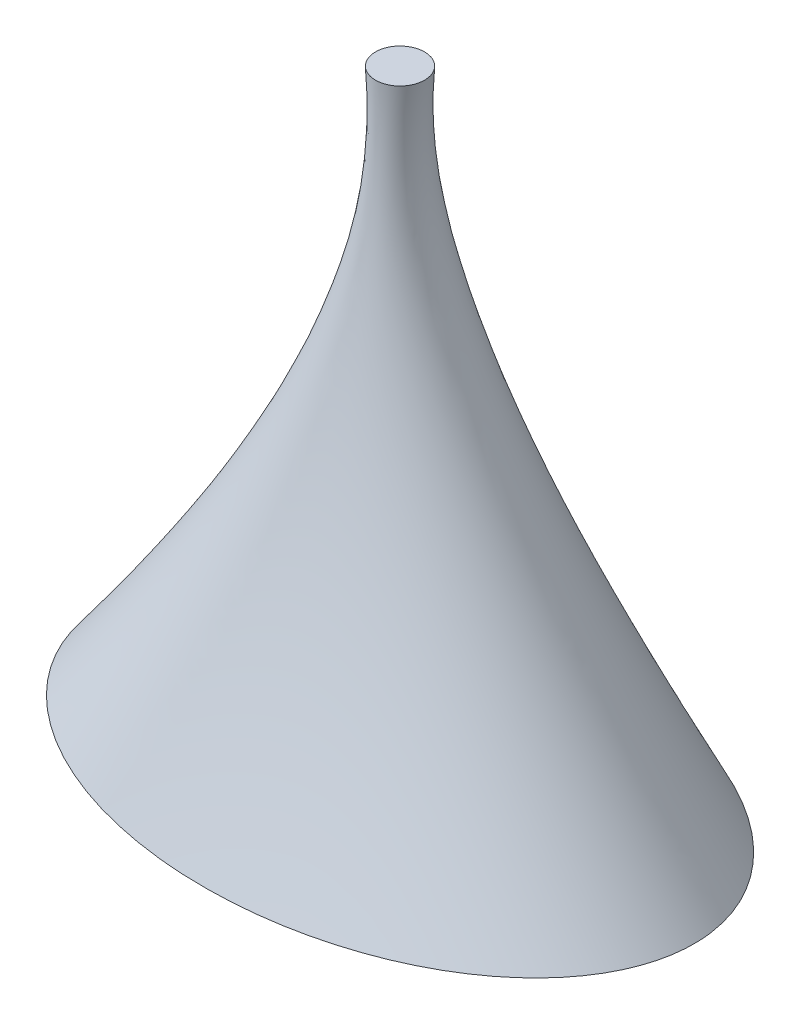
ISO-10303-21;
HEADER;
FILE_DESCRIPTION(('STEP AP214'),'2;1');
FILE_NAME('part.step','',(''),(''),'','','');
FILE_SCHEMA(('AUTOMOTIVE_DESIGN { 1 0 10303 214 1 1 1 1 }'));
ENDSEC;
DATA;
#1=APPLICATION_CONTEXT('core data for automotive mechanical design processes');
#2=APPLICATION_PROTOCOL_DEFINITION('international standard','automotive_design',2000,#1);
#3=PRODUCT_CONTEXT('',#1,'mechanical');
#4=PRODUCT('Part','Part','',(#3));
#5=PRODUCT_RELATED_PRODUCT_CATEGORY('part','',(#4));
#6=PRODUCT_DEFINITION_FORMATION('','',#4);
#7=PRODUCT_DEFINITION_CONTEXT('part definition',#1,'design');
#8=PRODUCT_DEFINITION('design','',#6,#7);
#9=PRODUCT_DEFINITION_SHAPE('','',#8);
#10=(LENGTH_UNIT() NAMED_UNIT(*) SI_UNIT(.MILLI.,.METRE.));
#11=(NAMED_UNIT(*) PLANE_ANGLE_UNIT() SI_UNIT($,.RADIAN.));
#12=(NAMED_UNIT(*) SI_UNIT($,.STERADIAN.) SOLID_ANGLE_UNIT());
#13=UNCERTAINTY_MEASURE_WITH_UNIT(LENGTH_MEASURE(1.E-05),#10,'distance_accuracy_value','');
#14=(GEOMETRIC_REPRESENTATION_CONTEXT(3) GLOBAL_UNCERTAINTY_ASSIGNED_CONTEXT((#13)) GLOBAL_UNIT_ASSIGNED_CONTEXT((#10,
#11,#12)) REPRESENTATION_CONTEXT('',''));
#15=CARTESIAN_POINT('',(0.,0.,0.));
#16=DIRECTION('',(0.,0.,1.));
#17=DIRECTION('',(1.,0.,0.));
#18=AXIS2_PLACEMENT_3D('',#15,#16,#17);
#19=CARTESIAN_POINT('',(0.,125.,0.));
#20=DIRECTION('',(0.,1.,0.));
#21=DIRECTION('',(0.,0.,1.));
#22=AXIS2_PLACEMENT_3D('',#19,#20,#21);
#23=PLANE('',#22);
#24=CARTESIAN_POINT('',(0.,125.,0.));
#25=DIRECTION('',(0.,1.,0.));
#26=DIRECTION('',(0.,0.,1.));
#27=AXIS2_PLACEMENT_3D('',#24,#25,#26);
#28=CIRCLE('',#27,5.);
#29=CARTESIAN_POINT('',(0.,125.,5.));
#30=VERTEX_POINT('',#29);
#31=EDGE_CURVE('E11',#30,#30,#28,.T.);
#32=ORIENTED_EDGE('',*,*,#31,.T.);
#33=EDGE_LOOP('',(#32));
#34=FACE_BOUND('',#33,.T.);
#35=ADVANCED_FACE('F171',(#34),#23,.T.);
#36=CARTESIAN_POINT('',(0.,0.,0.));
#37=DIRECTION('',(0.,1.,0.));
#38=DIRECTION('',(0.,0.,1.));
#39=AXIS2_PLACEMENT_3D('',#36,#37,#38);
#40=PLANE('',#39);
#41=CARTESIAN_POINT('',(0.,0.,0.));
#42=DIRECTION('',(0.,1.,0.));
#43=DIRECTION('',(-1.,0.,0.));
#44=AXIS2_PLACEMENT_3D('',#41,#42,#43);
#45=ELLIPSE('',#44,60.,40.);
#46=CARTESIAN_POINT('',(-60.,0.,0.));
#47=VERTEX_POINT('',#46);
#48=EDGE_CURVE('E179',#47,#47,#45,.T.);
#49=ORIENTED_EDGE('',*,*,#48,.F.);
#50=EDGE_LOOP('',(#49));
#51=FACE_BOUND('',#50,.T.);
#52=ADVANCED_FACE('F202',(#51),#40,.F.);
#53=CARTESIAN_POINT('',(5.57332550270318,0.,-39.8270597170702));
#54=CARTESIAN_POINT('',(3.2212642480343,27.7879100356075,-28.0145697247159));
#55=CARTESIAN_POINT('',(0.181030973703189,68.5723566828229,-11.8747715923263));
#56=CARTESIAN_POINT('',(0.330766092712323,111.121243368941,-4.69280956172269));
#57=CARTESIAN_POINT('',(1.23757826972021,125.,-4.84441947258042));
#58=CARTESIAN_POINT('',(4.78113844945781,0.,-39.8763295835393));
#59=CARTESIAN_POINT('',(2.69743364110282,27.7910347894172,-28.0425728521876));
#60=CARTESIAN_POINT('',(0.0201681260164546,68.5681633061748,-11.8787389328635));
#61=CARTESIAN_POINT('',(0.290784175121644,111.124368122751,-4.69934573589454));
#62=CARTESIAN_POINT('',(1.17073557418818,125.,-4.86149542315575));
#63=CARTESIAN_POINT('',(0.821290003085788,0.,-40.069752536723));
#64=CARTESIAN_POINT('',(0.0828115427077617,27.8038540957584,-28.1455239241916));
#65=CARTESIAN_POINT('',(-0.780944180964747,68.5509599733275,-11.8810467852571));
#66=CARTESIAN_POINT('',(0.092300938849589,111.137187429091,-4.72549640076909));
#67=CARTESIAN_POINT('',(0.836363096021454,125.,-4.93969850237796));
#68=CARTESIAN_POINT('',(-5.0952502478409,0.,-39.9661666214581));
#69=CARTESIAN_POINT('',(-3.8121457554207,27.8015098523949,-28.0268290352452));
#70=CARTESIAN_POINT('',(-1.95516129056789,68.5541059156883,-11.7530361886966));
#71=CARTESIAN_POINT('',(-0.191958678491041,111.134843185728,-4.71863268081314));
#72=CARTESIAN_POINT('',(0.334831114665666,125.,-5.00387511760623));
#73=CARTESIAN_POINT('',(-12.0647488528318,0.,-39.2477993765977));
#74=CARTESIAN_POINT('',(-8.38742537043965,27.7658927196401,-27.4754842079991));
#75=CARTESIAN_POINT('',(-3.29732032017669,68.601903618119,-11.4098976922342));
#76=CARTESIAN_POINT('',(-0.51719285809644,111.099226052973,-4.64518969153398));
#77=CARTESIAN_POINT('',(-0.259357499275969,125.,-5.00235695478864));
#78=CARTESIAN_POINT('',(-17.7393017685295,0.,-38.2784086796769));
#79=CARTESIAN_POINT('',(-12.1089988165161,27.7168661677891,-26.7615494224));
#80=CARTESIAN_POINT('',(-4.3639646494084,68.6676965766005,-11.0101025068101));
#81=CARTESIAN_POINT('',(-0.78046490821042,111.050199501122,-4.54440909060136));
#82=CARTESIAN_POINT('',(-0.746512299668394,125.,-4.952698355113));
#83=CARTESIAN_POINT('',(-23.2515310735226,0.,-36.9427307816643));
#84=CARTESIAN_POINT('',(-15.7219393929096,27.6506883744891,-25.7971828780172));
#85=CARTESIAN_POINT('',(-5.3702445738678,68.7565062652816,-10.5047374353318));
#86=CARTESIAN_POINT('',(-1.03596469609115,110.984021707822,-4.40642414441839));
#87=CARTESIAN_POINT('',(-1.22256603894635,125.,-4.85659263584071));
#88=CARTESIAN_POINT('',(-30.3092178201432,0.,-34.6951281799682));
#89=CARTESIAN_POINT('',(-20.3493832725471,27.5436473858479,-24.1906020672111));
#90=CARTESIAN_POINT('',(-6.62208563938298,68.9001538002525,-9.70010148995228));
#91=CARTESIAN_POINT('',(-1.36889776577987,110.876980719181,-4.17293943217995));
#92=CARTESIAN_POINT('',(-1.83849130817164,125.,-4.66863425398645));
#93=CARTESIAN_POINT('',(-36.9027134885698,0.,-31.7347146942922));
#94=CARTESIAN_POINT('',(-24.6731121888077,27.4139992106011,-22.0968065399869));
#95=CARTESIAN_POINT('',(-7.72476428456456,69.0741398688046,-8.71501171001037));
#96=CARTESIAN_POINT('',(-1.68475641646121,110.747332543934,-3.86974197519519));
#97=CARTESIAN_POINT('',(-2.42017955018995,125.,-4.39411784285191));
#98=CARTESIAN_POINT('',(-42.7559819688184,0.,-28.1553320722511));
#99=CARTESIAN_POINT('',(-28.5214020438933,27.2792817793337,-19.574734899846));
#100=CARTESIAN_POINT('',(-8.66212133160522,69.2549288092358,-7.58934762164839));
#101=CARTESIAN_POINT('',(-1.98736734905318,110.612615112667,-3.49922106624885));
#102=CARTESIAN_POINT('',(-2.95492997926846,125.,-4.04206132265627));
#103=CARTESIAN_POINT('',(-46.6875322605297,0.,-25.2261578393496));
#104=CARTESIAN_POINT('',(-31.1141307170032,27.1810542129565,-17.5057412392253));
#105=CARTESIAN_POINT('',(-9.28143896871314,69.3867488527106,-6.67908194084495));
#106=CARTESIAN_POINT('',(-2.208882065225,110.51438754629,-3.18180447890592));
#107=CARTESIAN_POINT('',(-3.32965926873877,125.,-3.74025269865595));
#108=CARTESIAN_POINT('',(-50.1596349148545,0.,-22.065589230787));
#109=CARTESIAN_POINT('',(-33.4077321504436,27.0883725579063,-15.2675796522241));
#110=CARTESIAN_POINT('',(-9.81379450350495,69.5111263594392,-5.70673715947108));
#111=CARTESIAN_POINT('',(-2.41810247135227,110.42170589124,-2.82497460598047));
#112=CARTESIAN_POINT('',(-3.67519040000185,125.,-3.40168166147901));
#113=CARTESIAN_POINT('',(-53.1440310717068,0.,-18.7032577855153));
#114=CARTESIAN_POINT('',(-35.3805690134177,27.0044764694147,-12.8817085204901));
#115=CARTESIAN_POINT('',(-10.2568516919458,69.6237137566455,-4.68353286940776));
#116=CARTESIAN_POINT('',(-2.60992943094225,110.337809802748,-2.43268013588069));
#117=CARTESIAN_POINT('',(-3.98807169697971,125.,-3.0297152085857));
#118=CARTESIAN_POINT('',(-55.6248331095162,0.,-15.1640932155241));
#119=CARTESIAN_POINT('',(-37.0182801853918,26.931665789461,-10.3674524606833));
#120=CARTESIAN_POINT('',(-10.6077343553895,69.7214246880152,-3.62004625899023));
#121=CARTESIAN_POINT('',(-2.7782924345961,110.264999122795,-2.00987054195542));
#122=CARTESIAN_POINT('',(-4.26485148359432,125.,-2.62772033743631));
#123=CARTESIAN_POINT('',(-57.5805573223675,0.,-11.4693021352257));
#124=CARTESIAN_POINT('',(-38.3035935520885,26.8718508821727,-7.73614078155367));
#125=CARTESIAN_POINT('',(-10.8636739984493,69.8016954711569,-2.51244430471587));
#126=CARTESIAN_POINT('',(-2.91871369459395,110.205184215506,-1.55287513984876));
#127=CARTESIAN_POINT('',(-4.50323753605284,125.,-2.19440367266726));
#128=CARTESIAN_POINT('',(-58.9911389371548,0.,-7.6537690225134));
#129=CARTESIAN_POINT('',(-39.2203202073334,26.8266448562351,-5.00726718995748));
#130=CARTESIAN_POINT('',(-11.0215065011754,69.8623613363939,-1.35613628799415));
#131=CARTESIAN_POINT('',(-3.02685266959215,110.159978189568,-1.05706906755834));
#132=CARTESIAN_POINT('',(-4.7009376305624,125.,-1.72847183891497));
#133=CARTESIAN_POINT('',(-59.8388761748041,0.,-3.72165980089621));
#134=CARTESIAN_POINT('',(-39.7537111666635,26.797764854187,-2.19623220474511));
#135=CARTESIAN_POINT('',(-11.0772250522638,69.9011179020495,-0.176535213550006));
#136=CARTESIAN_POINT('',(-3.09638031024818,110.13109818752,-0.541618806807593));
#137=CARTESIAN_POINT('',(-4.85287989017598,125.,-1.23973970398985));
#138=CARTESIAN_POINT('',(-60.0967926757585,0.,0.247118003628631));
#139=CARTESIAN_POINT('',(-39.8842988750661,26.7863551001767,0.637955320954993));
#140=CARTESIAN_POINT('',(-11.0262395638233,69.9164296350506,1.00299143870759));
#141=CARTESIAN_POINT('',(-3.12243204985721,110.11968843351,-0.0188047719322852));
#142=CARTESIAN_POINT('',(-4.95399243794657,125.,-0.738022135702308));
#143=CARTESIAN_POINT('',(-59.7691581112874,0.,4.17078029698523));
#144=CARTESIAN_POINT('',(-39.6166613362908,26.792858872814,3.43496879940429));
#145=CARTESIAN_POINT('',(-10.8744998508977,69.9077016615967,2.15910021527747));
#146=CARTESIAN_POINT('',(-3.10654742688881,110.126192206147,0.498210851620174));
#147=CARTESIAN_POINT('',(-5.00398724718396,125.,-0.234356624690946));
#148=CARTESIAN_POINT('',(-58.8724693371047,0.,8.04294048169223));
#149=CARTESIAN_POINT('',(-38.9633237576054,26.8165954820894,6.17768895906347));
#150=CARTESIAN_POINT('',(-10.6264078156176,69.8758474583214,3.26668371813831));
#151=CARTESIAN_POINT('',(-3.05006172700082,110.149928815423,0.98920819687241));
#152=CARTESIAN_POINT('',(-5.00257629119795,125.,0.260219338405634));
#153=CARTESIAN_POINT('',(-57.4162195719449,0.,11.8270340776387));
#154=CARTESIAN_POINT('',(-37.9335931081489,26.8569925217433,8.84504205022962));
#155=CARTESIAN_POINT('',(-10.287229460961,69.8216351865543,4.33083784852436));
#156=CARTESIAN_POINT('',(-2.95777768865238,110.190325855077,1.45749606452373));
#157=CARTESIAN_POINT('',(-4.95249644270007,125.,0.745715099079891));
#158=CARTESIAN_POINT('',(-55.4166923718935,0.,15.4992193221685));
#159=CARTESIAN_POINT('',(-36.5412178701254,26.9130240388591,11.4234393176973));
#160=CARTESIAN_POINT('',(-9.86133351373882,69.7464416610041,5.35610036401146));
#161=CARTESIAN_POINT('',(-2.83441267179757,110.246357372192,1.90538643813444));
#162=CARTESIAN_POINT('',(-4.85648457440183,125.,1.22214000282429));
#163=CARTESIAN_POINT('',(-52.8806099122792,0.,19.0336844448711));
#164=CARTESIAN_POINT('',(-34.7942275743768,26.9835461600074,13.8921540351699));
#165=CARTESIAN_POINT('',(-9.35132719194955,69.6518019440836,6.3327933170902));
#166=CARTESIAN_POINT('',(-2.68430941790748,110.316879493341,2.32632409152768));
#167=CARTESIAN_POINT('',(-4.71573267757515,125.,1.6849395294078));
#168=CARTESIAN_POINT('',(-49.8310955112112,0.,22.3966732734114));
#169=CARTESIAN_POINT('',(-32.7106816800946,27.0661940266499,16.2263900644702));
#170=CARTESIAN_POINT('',(-8.75858709892306,69.5408896434363,7.25077616059546));
#171=CARTESIAN_POINT('',(-2.51090650161521,110.399527359983,2.71498065459553));
#172=CARTESIAN_POINT('',(-4.53143274349195,125.,2.1295591585994));
#173=CARTESIAN_POINT('',(-46.2598843943868,0.,25.5766974778085));
#174=CARTESIAN_POINT('',(-30.2915644809613,27.1596513891902,18.4177619925606));
#175=CARTESIAN_POINT('',(-8.0880009870082,69.4154711479214,8.10716295897027));
#176=CARTESIAN_POINT('',(-2.32233845934943,110.492984722524,3.06905493863085));
#177=CARTESIAN_POINT('',(-4.30604536196897,125.,2.55363689691381));
#178=CARTESIAN_POINT('',(-42.2327451787448,0.,28.5046430582213));
#179=CARTESIAN_POINT('',(-27.5810967142616,27.2594965883809,20.4259653751115));
#180=CARTESIAN_POINT('',(-7.34163643869073,69.2814802634533,8.89893445137177));
#181=CARTESIAN_POINT('',(-2.1206206769804,110.592829921714,3.39274383687445));
#182=CARTESIAN_POINT('',(-4.04203112282299,125.,2.95481075086571));
#183=CARTESIAN_POINT('',(-37.8393944397212,0.,31.1246359651207));
#184=CARTESIAN_POINT('',(-24.6346700560955,27.3603986746669,22.2171752919905));
#185=CARTESIAN_POINT('',(-6.51715674143735,69.1460710510351,9.61732663054362));
#186=CARTESIAN_POINT('',(-1.90192973435437,110.693732008,3.68727302091207));
#187=CARTESIAN_POINT('',(-3.74028395710942,125.,3.329782558503));
#188=CARTESIAN_POINT('',(-33.0982967419764,0.,33.439967237339));
#189=CARTESIAN_POINT('',(-21.4658715541901,27.45900817898,23.7912133614625));
#190=CARTESIAN_POINT('',(-5.61519779546935,69.0137384521021,10.2525383816733));
#191=CARTESIAN_POINT('',(-1.6681389234616,110.792341512313,3.9480713084855));
#192=CARTESIAN_POINT('',(-3.40169779588368,125.,3.67525415787352));
#193=CARTESIAN_POINT('',(-28.0549336341112,0.,35.4292407819776));
#194=CARTESIAN_POINT('',(-18.1067367278928,27.5516717270273,25.1351241536073));
#195=CARTESIAN_POINT('',(-4.64463257853923,68.8893852447221,10.7969149720785));
#196=CARTESIAN_POINT('',(-1.42324660483837,110.885005060361,4.1743007692187));
#197=CARTESIAN_POINT('',(-3.02969844952953,125.,3.98800570539482));
#198=CARTESIAN_POINT('',(-22.7461146482497,0.,37.0832827657881));
#199=CARTESIAN_POINT('',(-14.5836398402852,27.6347645571587,26.2430526182473));
#200=CARTESIAN_POINT('',(-3.61546516070464,68.7778758091907,11.2423865098466));
#201=CARTESIAN_POINT('',(-1.1713712270726,110.968097890492,4.36407567937826));
#202=CARTESIAN_POINT('',(-2.62771172843075,125.,4.26481735748442));
#203=CARTESIAN_POINT('',(-17.203966683491,0.,38.3870057194704));
#204=CARTESIAN_POINT('',(-10.9133052196749,27.7044613641954,27.105489564585));
#205=CARTESIAN_POINT('',(-2.52475303822047,68.6843436524604,11.5799622143044));
#206=CARTESIAN_POINT('',(-0.906935892045749,111.037794697529,4.51633431652351));
#207=CARTESIAN_POINT('',(-2.19441269204738,125.,4.5032728473781));
#208=CARTESIAN_POINT('',(-11.4806463172432,0.,39.3274433532137));
#209=CARTESIAN_POINT('',(-7.12287469370834,27.7572868970712,27.7140125736758));
#210=CARTESIAN_POINT('',(-1.37050857293865,68.6134525136784,11.8007745163379));
#211=CARTESIAN_POINT('',(-0.621428082105848,111.090620230405,4.62968761040779));
#212=CARTESIAN_POINT('',(-1.72847639983947,125.,4.70095590831165));
#213=CARTESIAN_POINT('',(-5.58249356427619,0.,39.8925748051677));
#214=CARTESIAN_POINT('',(-3.22610077717778,27.7914746569241,28.0602064102002));
#215=CARTESIAN_POINT('',(-0.181983242082666,68.5675730100287,11.8968331193063));
#216=CARTESIAN_POINT('',(-0.33092825789369,111.124807990257,4.70039721505753));
#217=CARTESIAN_POINT('',(-1.23973478535005,125.,4.85286101245369));
#218=CARTESIAN_POINT('',(0.370679073195328,0.,40.0645334347085));
#219=CARTESIAN_POINT('',(0.699700371902132,27.8042604168041,28.132385126633));
#220=CARTESIAN_POINT('',(1.01226294980343,68.5504146960705,11.8601781083796));
#221=CARTESIAN_POINT('',(-0.0394321983095323,111.137593750138,4.72535125814249));
#222=CARTESIAN_POINT('',(-0.738019782122169,125.,4.95398263197284));
#223=CARTESIAN_POINT('',(6.25616933866184,0.,39.8461027395769));
#224=CARTESIAN_POINT('',(4.57600529394097,27.7955851042959,27.934779440977));
#225=CARTESIAN_POINT('',(2.18280066250424,68.5620568461736,11.6959655968838));
#226=CARTESIAN_POINT('',(0.248986116715864,111.128918437629,4.70670915335063));
#227=CARTESIAN_POINT('',(-0.23435942717582,125.,5.00399730813729));
#228=CARTESIAN_POINT('',(12.0644113149742,0.,39.2483143195083));
#229=CARTESIAN_POINT('',(8.38801375547082,27.7659309131903,27.4757714204791));
#230=CARTESIAN_POINT('',(3.29904427831529,68.6018523628997,11.4099307910766));
#231=CARTESIAN_POINT('',(0.518551707134026,111.099264246524,4.64528292895037));
#232=CARTESIAN_POINT('',(0.260218242469005,125.,5.00258158221525));
#233=CARTESIAN_POINT('',(17.7405507993775,0.,38.2774789501818));
#234=CARTESIAN_POINT('',(12.108344666811,27.7167890072187,26.760999618124));
#235=CARTESIAN_POINT('',(4.36091069312301,68.6678001250251,11.0099787554193));
#236=CARTESIAN_POINT('',(0.778455411345825,111.050122340552,4.54434107736264));
#237=CARTESIAN_POINT('',(0.745716916179653,125.,4.95249113903971));
#238=CARTESIAN_POINT('',(23.2488291529081,0.,36.9444619904788));
#239=CARTESIAN_POINT('',(15.7197875589823,27.6506570813782,25.7981559932357));
#240=CARTESIAN_POINT('',(5.36890645940203,68.756548260206,10.50465500826));
#241=CARTESIAN_POINT('',(1.03532831259252,110.983990414712,4.4061691085456));
#242=CARTESIAN_POINT('',(1.22214028332347,125.,4.85648166344367));
#243=CARTESIAN_POINT('',(28.5505265766271,0.,35.2537397224314));
#244=CARTESIAN_POINT('',(19.1965242058744,27.570371006414,24.5904067513189));
#245=CARTESIAN_POINT('',(6.3105712056951,68.8642910688956,9.9013644102939));
#246=CARTESIAN_POINT('',(1.2861317977979,110.903704339747,4.23173717897375));
#247=CARTESIAN_POINT('',(1.68493796451237,125.,4.71573536391365));
#248=CARTESIAN_POINT('',(33.5950099584065,0.,33.2207304581606));
#249=CARTESIAN_POINT('',(22.5052105530104,27.4791531980519,23.1469603472536));
#250=CARTESIAN_POINT('',(7.17466103000853,68.9867041134963,9.2075620640898));
#251=CARTESIAN_POINT('',(1.52824363431156,110.812486531385,4.0207630077707));
#252=CARTESIAN_POINT('',(2.12955958035827,125.,4.53143444893619));
#253=CARTESIAN_POINT('',(38.3650461913307,0.,30.8399228666254));
#254=CARTESIAN_POINT('',(25.6342792180636,27.3803116060438,21.4663053558418));
#255=CARTESIAN_POINT('',(7.95825904245316,69.1193481709249,8.43356902696771));
#256=CARTESIAN_POINT('',(1.76000765119264,110.713644939377,3.77705291745311));
#257=CARTESIAN_POINT('',(2.55363884102425,125.,4.30604420904226));
#258=CARTESIAN_POINT('',(42.7569646000475,0.,28.1551634864793));
#259=CARTESIAN_POINT('',(28.5217686809678,27.2792151644724,19.5746463282297));
#260=CARTESIAN_POINT('',(8.66162495166396,69.2550182054636,7.58931528912664));
#261=CARTESIAN_POINT('',(1.98699858538507,110.612548497806,3.49922396041872));
#262=CARTESIAN_POINT('',(2.95480945667344,125.,4.04202993476282));
#263=CARTESIAN_POINT('',(46.686953942502,0.,25.2262629411034));
#264=CARTESIAN_POINT('',(31.1139708850491,27.1811034340079,17.5057971001453));
#265=CARTESIAN_POINT('',(9.28187838654899,69.3866827987365,6.67910634601837));
#266=CARTESIAN_POINT('',(2.20918789054688,110.514436767341,3.18181116728876));
#267=CARTESIAN_POINT('',(3.32977945074873,125.,3.74028404181856));
#268=CARTESIAN_POINT('',(50.1599508557408,0.,22.065531172305));
#269=CARTESIAN_POINT('',(33.408032779764,27.0883778230696,15.2675503779976));
#270=CARTESIAN_POINT('',(9.81406656739001,69.5111192936623,5.70674909971473));
#271=CARTESIAN_POINT('',(2.41823677373221,110.421711156403,2.82499556041441));
#272=CARTESIAN_POINT('',(3.67525684669304,125.,3.40169894593014));
#273=CARTESIAN_POINT('',(53.1438611787891,0.,18.7032890817102));
#274=CARTESIAN_POINT('',(35.3804101732876,27.0044753848402,12.8817255863273));
#275=CARTESIAN_POINT('',(10.2567131187575,69.6237152121296,4.68352872213962));
#276=CARTESIAN_POINT('',(2.60984354125493,110.337808718173,2.43266579775967));
#277=CARTESIAN_POINT('',(3.98801123073997,125.,3.02969939885865));
#278=CARTESIAN_POINT('',(55.6249241349554,0.,15.1640764396789));
#279=CARTESIAN_POINT('',(37.0182875498096,26.9316532060447,10.3674431075715));
#280=CARTESIAN_POINT('',(10.6076141047891,69.721441574787,3.62004179762753));
#281=CARTESIAN_POINT('',(2.77821291925472,110.264986539378,2.0098655826956));
#282=CARTESIAN_POINT('',(4.26481218912314,125.,2.62771015236515));
#283=CARTESIAN_POINT('',(57.5805086063746,0.,11.4693111119685));
#284=CARTESIAN_POINT('',(38.303589535641,26.8718576253032,7.73614578471048));
#285=CARTESIAN_POINT('',(10.8637388047117,69.8016864219684,2.51244661609551));
#286=CARTESIAN_POINT('',(2.91875891474017,110.205190958637,1.55287859382206));
#287=CARTESIAN_POINT('',(4.50326267502341,125.,2.19441032563586));
#288=CARTESIAN_POINT('',(58.9911649782475,0.,7.65376422887989));
#289=CARTESIAN_POINT('',(39.2203646543528,26.8266485861021,5.00726473485538));
#290=CARTESIAN_POINT('',(11.0215785250312,69.8623563309637,1.35613809301459));
#291=CARTESIAN_POINT('',(3.02689842993581,110.159981919435,1.05707460750679));
#292=CARTESIAN_POINT('',(4.70096564162166,125.,1.728479037857));
#293=CARTESIAN_POINT('',(59.8388623045363,0.,3.72166234475999));
#294=CARTESIAN_POINT('',(39.7537028888439,26.7977656411078,2.19623347097864));
#295=CARTESIAN_POINT('',(11.0772258329523,69.9011168460129,0.176534651488606));
#296=CARTESIAN_POINT('',(3.09638130998074,110.131098974441,0.541618256913898));
#297=CARTESIAN_POINT('',(4.85287993624315,125.,1.23973952366291));
#298=CARTESIAN_POINT('',(60.0967999710171,0.,-0.247119323988128));
#299=CARTESIAN_POINT('',(39.8842743243547,26.7863494794865,-0.637956373718784));
#300=CARTESIAN_POINT('',(11.0261656883937,69.9164371779396,-1.00299272410005));
#301=CARTESIAN_POINT('',(3.12238394782264,110.11968281282,0.0187998540653152));
#302=CARTESIAN_POINT('',(4.95396440621315,125.,0.738015017687931));
#303=CARTESIAN_POINT('',(59.7691544477168,0.,-4.17077966742625));
#304=CARTESIAN_POINT('',(39.616634469902,26.7928546957631,-3.43496864570873));
#305=CARTESIAN_POINT('',(10.8744373990849,69.9077072671414,-2.15910047265735));
#306=CARTESIAN_POINT('',(3.1065061697376,110.126188029096,-0.498215264002163));
#307=CARTESIAN_POINT('',(5.00396199749202,125.,0.234350405133928));
#308=CARTESIAN_POINT('',(58.8724708470934,0.,-8.04294067445268));
#309=CARTESIAN_POINT('',(38.9633707161917,26.8166037403454,-6.17768805562041));
#310=CARTESIAN_POINT('',(10.6265241999839,69.8758363758554,-3.26668199755284));
#311=CARTESIAN_POINT('',(3.05013392221037,110.149937073679,-0.989200558515957));
#312=CARTESIAN_POINT('',(5.00261565604015,125.,-0.260209428797237));
#313=CARTESIAN_POINT('',(57.4162196063155,0.,-11.8270342439057));
#314=CARTESIAN_POINT('',(37.9336515205748,26.857002457699,-8.84504102431151));
#315=CARTESIAN_POINT('',(10.2873762068729,69.8216218526386,-4.33083762478137));
#316=CARTESIAN_POINT('',(2.95787650477437,110.190335791032,-1.4574848419638));
#317=CARTESIAN_POINT('',(4.95255708291809,125.,-0.745699970379487));
#318=CARTESIAN_POINT('',(55.4166907792947,0.,-15.4992187297921));
#319=CARTESIAN_POINT('',(36.541101862524,26.9130036862894,-11.4234439937519));
#320=CARTESIAN_POINT('',(9.86104794723331,69.7464689738725,-5.35610557806814));
#321=CARTESIAN_POINT('',(2.83425332987284,110.246337019623,-1.90540264447016));
#322=CARTESIAN_POINT('',(4.85641797918635,125.,-1.22215670588674));
#323=CARTESIAN_POINT('',(52.8806137056689,0.,-19.033685702357));
#324=CARTESIAN_POINT('',(34.7940566201852,26.9835178568953,-13.8921622364991));
#325=CARTESIAN_POINT('',(9.35090312047227,69.6518399264709,-6.33279748877833));
#326=CARTESIAN_POINT('',(2.68405560570508,110.316851190229,-2.32635154783767));
#327=CARTESIAN_POINT('',(4.7156121881722,125.,-1.68496966930058));
#328=CARTESIAN_POINT('',(49.8310879864604,0.,-22.3966708434806));
#329=CARTESIAN_POINT('',(32.7108719617684,27.0662263613341,-16.2263794219852));
#330=CARTESIAN_POINT('',(8.75906334688676,69.5408462507344,-7.2507701847727));
#331=CARTESIAN_POINT('',(2.51118235010505,110.399559694668,-2.71495145590688));
#332=CARTESIAN_POINT('',(4.53155355320291,125.,-2.1295288946026));
#333=CARTESIAN_POINT('',(46.2598986871149,0.,-25.5767020604715));
#334=CARTESIAN_POINT('',(30.2919284745686,27.1597011609381,-18.4177475325476));
#335=CARTESIAN_POINT('',(8.08884930319594,69.4154043549203,-8.10715456951771));
#336=CARTESIAN_POINT('',(2.32284547254814,110.493034494271,-3.06899922807874));
#337=CARTESIAN_POINT('',(4.30627424291011,125.,-2.55357960287426));
#338=CARTESIAN_POINT('',(42.2327183460264,0.,-28.5046344746915));
#339=CARTESIAN_POINT('',(27.580731479093,27.259447775377,-20.4259772769795));
#340=CARTESIAN_POINT('',(7.34080218387331,69.2815457698334,-8.89894294459993));
#341=CARTESIAN_POINT('',(2.12012367871996,110.59278110871,-3.39279896842574));
#342=CARTESIAN_POINT('',(4.04180642592544,125.,-2.95486701519703));
#343=CARTESIAN_POINT('',(37.8394446828111,0.,-31.1246520061593));
#344=CARTESIAN_POINT('',(24.6340056577838,27.3603159892171,-22.2172183495145));
#345=CARTESIAN_POINT('',(6.51554180570487,69.1461820137716,-9.6173423537705));
#346=CARTESIAN_POINT('',(1.90094528086538,110.693649322551,-3.6873770042209));
#347=CARTESIAN_POINT('',(3.73985493677277,125.,-3.32988997576844));
#348=CARTESIAN_POINT('',(33.0982024550128,0.,-33.4399373197612));
#349=CARTESIAN_POINT('',(21.4664179148538,27.4590829758206,-23.7911689996929));
#350=CARTESIAN_POINT('',(5.61660598453897,69.0136380757702,-10.2525302817328));
#351=CARTESIAN_POINT('',(1.66903472337362,110.792416309154,-3.94797564139896));
#352=CARTESIAN_POINT('',(3.40212460997597,125.,-3.67514732878602));
#353=CARTESIAN_POINT('',(28.055112963889,0.,-35.4292962146778));
#354=CARTESIAN_POINT('',(18.108189061826,27.5517815015183,-25.1350962824945));
#355=CARTESIAN_POINT('',(4.6476818916287,68.8892379288646,-10.7968728418446));
#356=CARTESIAN_POINT('',(1.42510331986462,110.885114834852,-4.17410295072824));
#357=CARTESIAN_POINT('',(3.03049576287394,125.,-3.98780604361575));
#358=CARTESIAN_POINT('',(22.7457536524606,0.,-37.0831830040329));
#359=CARTESIAN_POINT('',(14.5826671854524,27.6346997936962,-26.2430129744481));
#360=CARTESIAN_POINT('',(3.61373575579277,68.777962720867,-11.2423703719831));
#361=CARTESIAN_POINT('',(1.17009228560994,110.968033127029,-4.3642459333852));
#362=CARTESIAN_POINT('',(2.6268487128056,125.,-4.26503308962363));
#363=CARTESIAN_POINT('',(16.0966907804447,0.,-38.6479533005362));
#364=CARTESIAN_POINT('',(10.1780199742837,27.7183076217777,-27.2781269745422));
#365=CARTESIAN_POINT('',(2.30221343634019,68.6657621651674,-11.6475398512784));
#366=CARTESIAN_POINT('',(0.850888612749805,111.051640955111,-4.54706322555146));
#367=CARTESIAN_POINT('',(2.10619299328765,125.,-4.5513546492196));
#368=CARTESIAN_POINT('',(10.3107468019909,0.,-39.4795245556699));
#369=CARTESIAN_POINT('',(6.35199098584629,27.7663570500422,-27.8104968111072));
#370=CARTESIAN_POINT('',(1.14150336582625,68.6012804931039,-11.8331393993463));
#371=CARTESIAN_POINT('',(0.568940336299702,111.099690383375,-4.64786539308837));
#372=CARTESIAN_POINT('',(1.63533182876769,125.,-4.73559017785545));
#373=CARTESIAN_POINT('',(6.36551255594853,0.,-39.7777898506011));
#374=CARTESIAN_POINT('',(3.74509485496577,27.7847852817978,-27.9865665972442));
#375=CARTESIAN_POINT('',(0.34189382138992,68.576550059471,-11.8708042517892));
#376=CARTESIAN_POINT('',(0.370748010303001,111.118118615131,-4.68627338755084));
#377=CARTESIAN_POINT('',(1.30442096525223,125.,-4.82734352200509));
#378=CARTESIAN_POINT('',(5.57332550270318,0.,-39.8270597170702));
#379=CARTESIAN_POINT('',(3.2212642480343,27.7879100356075,-28.0145697247159));
#380=CARTESIAN_POINT('',(0.181030973703189,68.5723566828229,-11.8747715923263));
#381=CARTESIAN_POINT('',(0.330766092712323,111.121243368941,-4.69280956172269));
#382=CARTESIAN_POINT('',(1.23757826972021,125.,-4.84441947258042));
#383=B_SPLINE_SURFACE_WITH_KNOTS('',3,3,((#53,#54,#55,#56,#57),(#58,#59,#60,#61,#62),(#63,#64,
#65,#66,#67),(#68,#69,#70,#71,#72),(#73,#74,#75,#76,#77),(#78,#79,#80,#81,#82),(#83,#84,#85,#86,
#87),(#88,#89,#90,#91,#92),(#93,#94,#95,#96,#97),(#98,#99,#100,#101,#102),(#103,#104,#105,#106,
#107),(#108,#109,#110,#111,#112),(#113,#114,#115,#116,#117),(#118,#119,#120,#121,#122),(#123,
#124,#125,#126,#127),(#128,#129,#130,#131,#132),(#133,#134,#135,#136,#137),(#138,#139,#140,#141,
#142),(#143,#144,#145,#146,#147),(#148,#149,#150,#151,#152),(#153,#154,#155,#156,#157),(#158,
#159,#160,#161,#162),(#163,#164,#165,#166,#167),(#168,#169,#170,#171,#172),(#173,#174,#175,#176,
#177),(#178,#179,#180,#181,#182),(#183,#184,#185,#186,#187),(#188,#189,#190,#191,#192),(#193,
#194,#195,#196,#197),(#198,#199,#200,#201,#202),(#203,#204,#205,#206,#207),(#208,#209,#210,#211,
#212),(#213,#214,#215,#216,#217),(#218,#219,#220,#221,#222),(#223,#224,#225,#226,#227),(#228,
#229,#230,#231,#232),(#233,#234,#235,#236,#237),(#238,#239,#240,#241,#242),(#243,#244,#245,#246,
#247),(#248,#249,#250,#251,#252),(#253,#254,#255,#256,#257),(#258,#259,#260,#261,#262),(#263,
#264,#265,#266,#267),(#268,#269,#270,#271,#272),(#273,#274,#275,#276,#277),(#278,#279,#280,#281,
#282),(#283,#284,#285,#286,#287),(#288,#289,#290,#291,#292),(#293,#294,#295,#296,#297),(#298,
#299,#300,#301,#302),(#303,#304,#305,#306,#307),(#308,#309,#310,#311,#312),(#313,#314,#315,#316,
#317),(#318,#319,#320,#321,#322),(#323,#324,#325,#326,#327),(#328,#329,#330,#331,#332),(#333,
#334,#335,#336,#337),(#338,#339,#340,#341,#342),(#343,#344,#345,#346,#347),(#348,#349,#350,#351,
#352),(#353,#354,#355,#356,#357),(#358,#359,#360,#361,#362),(#363,#364,#365,#366,#367),(#368,
#369,#370,#371,#372),(#373,#374,#375,#376,#377),(#378,#379,#380,#381,#382)),.UNSPECIFIED.,.T.,
.F.,.F.,(4,1,1,1,1,1,1,1,1,1,1,1,1,1,1,1,1,1,1,1,1,1,1,1,1,1,1,1,1,1,1,1,1,1,1,1,1,1,1,1,1,1,1,
1,1,1,1,1,1,1,1,1,1,1,1,1,1,1,1,1,1,1,1,4),(4,1,4),(0.,0.00625000000000009,0.03125,0.046875,
0.0625,0.078125,0.09375,0.125,0.140625,0.15625,0.171875,0.1875,0.203125,0.21875,0.234375,0.25,
0.265625,0.28125,0.296875,0.3125,0.328125,0.34375,0.359375,0.375,0.390625,0.40625,0.421875,
0.4375,0.453125,0.46875,0.484375,0.5,0.515625,0.53125,0.546875,0.5625,0.578125,0.59375,0.609375,
0.625,0.640625,0.65625,0.671875,0.6875,0.703125,0.71875,0.734375,0.75,0.765625,0.78125,0.796875,
0.8125,0.828125,0.84375,0.859375,0.875,0.890625,0.90625,0.921875,0.9375,0.953125,0.96875,
0.99375,1.),(0.,0.691065447799569,1.),.UNSPECIFIED.);
#384=ORIENTED_EDGE('',*,*,#48,.T.);
#385=EDGE_LOOP('',(#384));
#386=FACE_BOUND('',#385,.T.);
#387=ORIENTED_EDGE('',*,*,#31,.F.);
#388=EDGE_LOOP('',(#387));
#389=FACE_BOUND('',#388,.T.);
#390=ADVANCED_FACE('F210',(#386,#389),#383,.T.);
#391=CLOSED_SHELL('',(#35,#52,#390));
#392=MANIFOLD_SOLID_BREP('B2',#391);
#393=ADVANCED_BREP_SHAPE_REPRESENTATION('',(#18,#392),#14);
#394=SHAPE_DEFINITION_REPRESENTATION(#9,#393);
ENDSEC;
END-ISO-10303-21;
